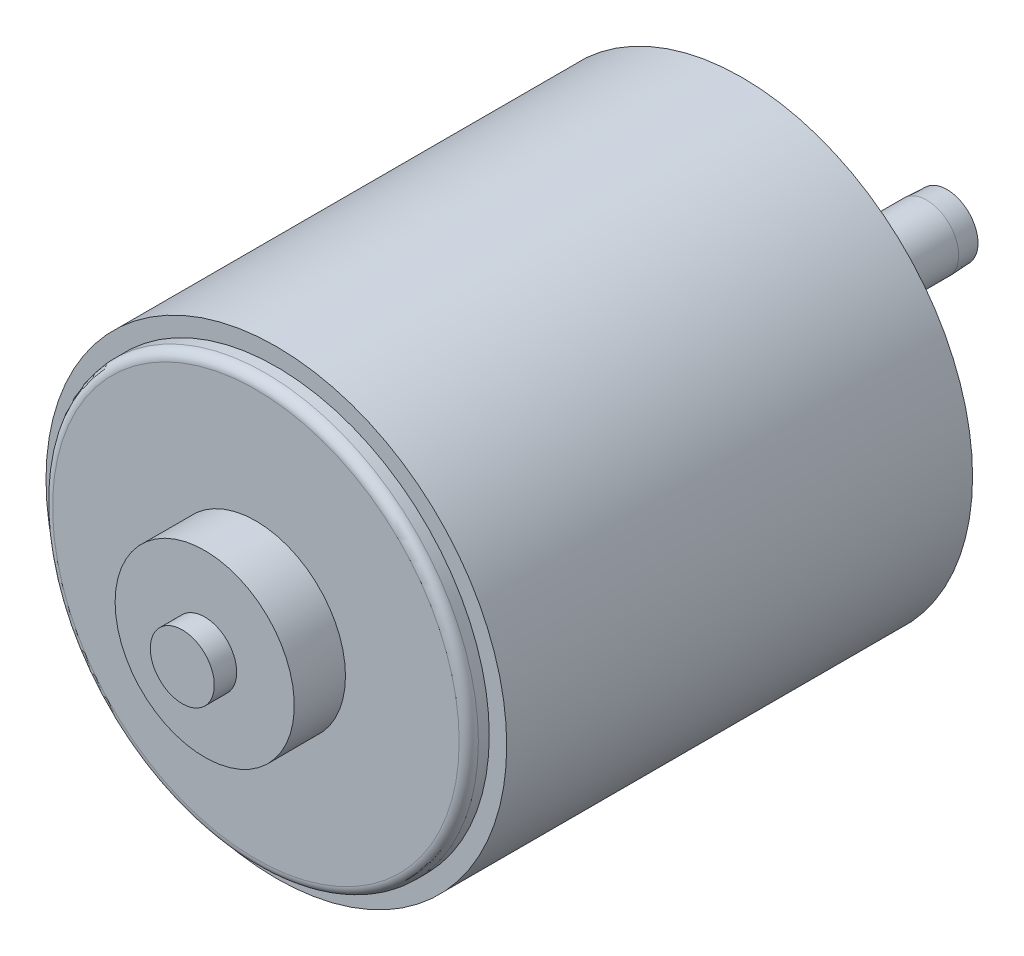
ISO-10303-21;
HEADER;
FILE_DESCRIPTION(('STEP AP214'),'2;1');
FILE_NAME('part.step','',(''),(''),'','','');
FILE_SCHEMA(('AUTOMOTIVE_DESIGN { 1 0 10303 214 1 1 1 1 }'));
ENDSEC;
DATA;
#1=APPLICATION_CONTEXT('core data for automotive mechanical design processes');
#2=APPLICATION_PROTOCOL_DEFINITION('international standard','automotive_design',2000,#1);
#3=PRODUCT_CONTEXT('',#1,'mechanical');
#4=PRODUCT('Part','Part','',(#3));
#5=PRODUCT_RELATED_PRODUCT_CATEGORY('part','',(#4));
#6=PRODUCT_DEFINITION_FORMATION('','',#4);
#7=PRODUCT_DEFINITION_CONTEXT('part definition',#1,'design');
#8=PRODUCT_DEFINITION('design','',#6,#7);
#9=PRODUCT_DEFINITION_SHAPE('','',#8);
#10=(LENGTH_UNIT() NAMED_UNIT(*) SI_UNIT(.MILLI.,.METRE.));
#11=(NAMED_UNIT(*) PLANE_ANGLE_UNIT() SI_UNIT($,.RADIAN.));
#12=(NAMED_UNIT(*) SI_UNIT($,.STERADIAN.) SOLID_ANGLE_UNIT());
#13=UNCERTAINTY_MEASURE_WITH_UNIT(LENGTH_MEASURE(1.E-05),#10,'distance_accuracy_value','');
#14=(GEOMETRIC_REPRESENTATION_CONTEXT(3) GLOBAL_UNCERTAINTY_ASSIGNED_CONTEXT((#13)) GLOBAL_UNIT_ASSIGNED_CONTEXT((#10,
#11,#12)) REPRESENTATION_CONTEXT('',''));
#15=CARTESIAN_POINT('',(0.,0.,0.));
#16=DIRECTION('',(0.,0.,1.));
#17=DIRECTION('',(1.,0.,0.));
#18=AXIS2_PLACEMENT_3D('',#15,#16,#17);
#19=CARTESIAN_POINT('',(0.,0.,38.));
#20=DIRECTION('',(0.,0.,-1.));
#21=DIRECTION('',(-1.,0.,0.));
#22=AXIS2_PLACEMENT_3D('',#19,#20,#21);
#23=CYLINDRICAL_SURFACE('',#22,18.);
#24=CARTESIAN_POINT('',(0.,0.,0.));
#25=DIRECTION('',(0.,0.,1.));
#26=DIRECTION('',(1.,0.,0.));
#27=AXIS2_PLACEMENT_3D('',#24,#25,#26);
#28=CIRCLE('',#27,18.);
#29=CARTESIAN_POINT('',(18.,0.,0.));
#30=VERTEX_POINT('',#29);
#31=EDGE_CURVE('E141',#30,#30,#28,.T.);
#32=ORIENTED_EDGE('',*,*,#31,.T.);
#33=EDGE_LOOP('',(#32));
#34=FACE_BOUND('',#33,.T.);
#35=CARTESIAN_POINT('',(0.,0.,36.4));
#36=DIRECTION('',(0.,0.,1.));
#37=DIRECTION('',(1.,0.,0.));
#38=AXIS2_PLACEMENT_3D('',#35,#36,#37);
#39=CIRCLE('',#38,18.);
#40=CARTESIAN_POINT('',(18.,0.,36.4));
#41=VERTEX_POINT('',#40);
#42=EDGE_CURVE('E252',#41,#41,#39,.T.);
#43=ORIENTED_EDGE('',*,*,#42,.F.);
#44=EDGE_LOOP('',(#43));
#45=FACE_BOUND('',#44,.T.);
#46=ADVANCED_FACE('F71',(#34,#45),#23,.T.);
#47=CARTESIAN_POINT('',(0.,0.,0.));
#48=DIRECTION('',(0.,0.,1.));
#49=DIRECTION('',(1.,0.,0.));
#50=AXIS2_PLACEMENT_3D('',#47,#48,#49);
#51=PLANE('',#50);
#52=CARTESIAN_POINT('',(0.,12.5,0.));
#53=DIRECTION('',(0.,0.,-1.));
#54=DIRECTION('',(-1.,0.,0.));
#55=AXIS2_PLACEMENT_3D('',#52,#53,#54);
#56=CIRCLE('',#55,1.25);
#57=CARTESIAN_POINT('',(-1.25,12.5,0.));
#58=VERTEX_POINT('',#57);
#59=EDGE_CURVE('E105',#58,#58,#56,.T.);
#60=ORIENTED_EDGE('',*,*,#59,.F.);
#61=EDGE_LOOP('',(#60));
#62=FACE_BOUND('',#61,.T.);
#63=CARTESIAN_POINT('',(10.8253175473055,6.24999999999997,0.));
#64=DIRECTION('',(0.,0.,-1.));
#65=DIRECTION('',(-1.,0.,0.));
#66=AXIS2_PLACEMENT_3D('',#63,#64,#65);
#67=CIRCLE('',#66,1.25);
#68=CARTESIAN_POINT('',(9.5753175473055,6.24999999999997,0.));
#69=VERTEX_POINT('',#68);
#70=EDGE_CURVE('E104',#69,#69,#67,.T.);
#71=ORIENTED_EDGE('',*,*,#70,.F.);
#72=EDGE_LOOP('',(#71));
#73=FACE_BOUND('',#72,.T.);
#74=CARTESIAN_POINT('',(0.,-12.5,0.));
#75=DIRECTION('',(0.,0.,-1.));
#76=DIRECTION('',(-1.,0.,0.));
#77=AXIS2_PLACEMENT_3D('',#74,#75,#76);
#78=CIRCLE('',#77,1.25);
#79=CARTESIAN_POINT('',(-1.25,-12.5,0.));
#80=VERTEX_POINT('',#79);
#81=EDGE_CURVE('E123',#80,#80,#78,.T.);
#82=ORIENTED_EDGE('',*,*,#81,.F.);
#83=EDGE_LOOP('',(#82));
#84=FACE_BOUND('',#83,.T.);
#85=CARTESIAN_POINT('',(-10.8253175473055,6.24999999999998,0.));
#86=DIRECTION('',(0.,0.,-1.));
#87=DIRECTION('',(-1.,0.,0.));
#88=AXIS2_PLACEMENT_3D('',#85,#86,#87);
#89=CIRCLE('',#88,1.25);
#90=CARTESIAN_POINT('',(-12.0753175473055,6.24999999999998,0.));
#91=VERTEX_POINT('',#90);
#92=EDGE_CURVE('E129',#91,#91,#89,.T.);
#93=ORIENTED_EDGE('',*,*,#92,.F.);
#94=EDGE_LOOP('',(#93));
#95=FACE_BOUND('',#94,.T.);
#96=CARTESIAN_POINT('',(0.,0.,0.));
#97=DIRECTION('',(0.,0.,1.));
#98=DIRECTION('',(1.,0.,0.));
#99=AXIS2_PLACEMENT_3D('',#96,#97,#98);
#100=CIRCLE('',#99,7.);
#101=CARTESIAN_POINT('',(7.,0.,0.));
#102=VERTEX_POINT('',#101);
#103=EDGE_CURVE('E149',#102,#102,#100,.F.);
#104=ORIENTED_EDGE('',*,*,#103,.F.);
#105=EDGE_LOOP('',(#104));
#106=FACE_BOUND('',#105,.T.);
#107=ORIENTED_EDGE('',*,*,#31,.F.);
#108=EDGE_LOOP('',(#107));
#109=FACE_BOUND('',#108,.T.);
#110=ADVANCED_FACE('F182',(#62,#73,#84,#95,#106,#109),#51,.F.);
#111=CARTESIAN_POINT('',(0.,0.,-4.));
#112=DIRECTION('',(0.,0.,1.));
#113=DIRECTION('',(1.,0.,0.));
#114=AXIS2_PLACEMENT_3D('',#111,#112,#113);
#115=CYLINDRICAL_SURFACE('',#114,7.);
#116=CARTESIAN_POINT('',(0.,0.,-4.));
#117=DIRECTION('',(0.,0.,-1.));
#118=DIRECTION('',(-1.,0.,0.));
#119=AXIS2_PLACEMENT_3D('',#116,#117,#118);
#120=CIRCLE('',#119,7.);
#121=CARTESIAN_POINT('',(-7.,0.,-4.));
#122=VERTEX_POINT('',#121);
#123=EDGE_CURVE('E137',#122,#122,#120,.T.);
#124=ORIENTED_EDGE('',*,*,#123,.F.);
#125=EDGE_LOOP('',(#124));
#126=FACE_BOUND('',#125,.T.);
#127=ORIENTED_EDGE('',*,*,#103,.T.);
#128=EDGE_LOOP('',(#127));
#129=FACE_BOUND('',#128,.T.);
#130=ADVANCED_FACE('F186',(#126,#129),#115,.T.);
#131=CARTESIAN_POINT('',(0.,0.,-4.));
#132=DIRECTION('',(0.,0.,-1.));
#133=DIRECTION('',(-1.,0.,0.));
#134=AXIS2_PLACEMENT_3D('',#131,#132,#133);
#135=PLANE('',#134);
#136=CARTESIAN_POINT('',(0.,0.,-4.));
#137=DIRECTION('',(0.,0.,-1.));
#138=DIRECTION('',(-1.,0.,0.));
#139=AXIS2_PLACEMENT_3D('',#136,#137,#138);
#140=CIRCLE('',#139,2.5);
#141=CARTESIAN_POINT('',(-2.5,0.,-4.));
#142=VERTEX_POINT('',#141);
#143=EDGE_CURVE('E145',#142,#142,#140,.F.);
#144=ORIENTED_EDGE('',*,*,#143,.T.);
#145=EDGE_LOOP('',(#144));
#146=FACE_BOUND('',#145,.T.);
#147=ORIENTED_EDGE('',*,*,#123,.T.);
#148=EDGE_LOOP('',(#147));
#149=FACE_BOUND('',#148,.T.);
#150=ADVANCED_FACE('F203',(#146,#149),#135,.T.);
#151=CARTESIAN_POINT('',(0.,0.,45.));
#152=DIRECTION('',(0.,0.,-1.));
#153=DIRECTION('',(-1.,0.,0.));
#154=AXIS2_PLACEMENT_3D('',#151,#152,#153);
#155=CYLINDRICAL_SURFACE('',#154,2.5);
#156=CARTESIAN_POINT('',(0.,0.,-14.4125));
#157=DIRECTION('',(0.,0.,1.));
#158=DIRECTION('',(1.,0.,0.));
#159=AXIS2_PLACEMENT_3D('',#156,#157,#158);
#160=CIRCLE('',#159,2.5);
#161=CARTESIAN_POINT('',(-2.5,0.,-14.4125));
#162=VERTEX_POINT('',#161);
#163=EDGE_CURVE('E253',#162,#162,#160,.T.);
#164=CARTESIAN_POINT('',(-2.5,0.,-14.4125));
#165=CARTESIAN_POINT('',(-2.5,0.,-14.3040364583333));
#166=CARTESIAN_POINT('',(-2.5,0.,-14.1955729166666));
#167=CARTESIAN_POINT('',(-2.5,0.,-13.9786458333333));
#168=CARTESIAN_POINT('',(-2.5,0.,-13.8701822916666));
#169=CARTESIAN_POINT('',(-2.5,0.,-13.6532552083333));
#170=CARTESIAN_POINT('',(-2.5,0.,-13.5447916666666));
#171=CARTESIAN_POINT('',(-2.5,0.,-13.3278645833333));
#172=CARTESIAN_POINT('',(-2.5,0.,-13.2194010416666));
#173=CARTESIAN_POINT('',(-2.5,0.,-13.0024739583333));
#174=CARTESIAN_POINT('',(-2.5,0.,-12.8940104166666));
#175=CARTESIAN_POINT('',(-2.5,0.,-12.6770833333333));
#176=CARTESIAN_POINT('',(-2.5,0.,-12.5686197916666));
#177=CARTESIAN_POINT('',(-2.5,0.,-12.3516927083333));
#178=CARTESIAN_POINT('',(-2.5,0.,-12.2432291666666));
#179=CARTESIAN_POINT('',(-2.5,0.,-12.0263020833333));
#180=CARTESIAN_POINT('',(-2.5,0.,-11.9178385416666));
#181=CARTESIAN_POINT('',(-2.5,0.,-11.7009114583333));
#182=CARTESIAN_POINT('',(-2.5,0.,-11.5924479166666));
#183=CARTESIAN_POINT('',(-2.5,0.,-11.3755208333333));
#184=CARTESIAN_POINT('',(-2.5,0.,-11.2670572916666));
#185=CARTESIAN_POINT('',(-2.5,0.,-11.0501302083333));
#186=CARTESIAN_POINT('',(-2.5,0.,-10.9416666666666));
#187=CARTESIAN_POINT('',(-2.5,0.,-10.7247395833333));
#188=CARTESIAN_POINT('',(-2.5,0.,-10.6162760416666));
#189=CARTESIAN_POINT('',(-2.5,0.,-10.3993489583333));
#190=CARTESIAN_POINT('',(-2.5,0.,-10.2908854166666));
#191=CARTESIAN_POINT('',(-2.5,0.,-10.0739583333333));
#192=CARTESIAN_POINT('',(-2.5,0.,-9.96549479166665));
#193=CARTESIAN_POINT('',(-2.5,0.,-9.74856770833332));
#194=CARTESIAN_POINT('',(-2.5,0.,-9.64010416666665));
#195=CARTESIAN_POINT('',(-2.5,0.,-9.42317708333332));
#196=CARTESIAN_POINT('',(-2.5,0.,-9.31471354166665));
#197=CARTESIAN_POINT('',(-2.5,0.,-9.09778645833332));
#198=CARTESIAN_POINT('',(-2.5,0.,-8.98932291666665));
#199=CARTESIAN_POINT('',(-2.5,0.,-8.77239583333332));
#200=CARTESIAN_POINT('',(-2.5,0.,-8.66393229166666));
#201=CARTESIAN_POINT('',(-2.5,0.,-8.44700520833332));
#202=CARTESIAN_POINT('',(-2.5,0.,-8.33854166666666));
#203=CARTESIAN_POINT('',(-2.5,0.,-8.12161458333332));
#204=CARTESIAN_POINT('',(-2.5,0.,-8.01315104166665));
#205=CARTESIAN_POINT('',(-2.5,0.,-7.79622395833332));
#206=CARTESIAN_POINT('',(-2.5,0.,-7.68776041666665));
#207=CARTESIAN_POINT('',(-2.5,0.,-7.47083333333332));
#208=CARTESIAN_POINT('',(-2.5,0.,-7.36236979166666));
#209=CARTESIAN_POINT('',(-2.5,0.,-7.14544270833332));
#210=CARTESIAN_POINT('',(-2.5,0.,-7.03697916666666));
#211=CARTESIAN_POINT('',(-2.5,0.,-6.82005208333333));
#212=CARTESIAN_POINT('',(-2.5,0.,-6.71158854166666));
#213=CARTESIAN_POINT('',(-2.5,0.,-6.49466145833333));
#214=CARTESIAN_POINT('',(-2.5,0.,-6.38619791666666));
#215=CARTESIAN_POINT('',(-2.5,0.,-6.16927083333332));
#216=CARTESIAN_POINT('',(-2.5,0.,-6.06080729166666));
#217=CARTESIAN_POINT('',(-2.5,0.,-5.84388020833333));
#218=CARTESIAN_POINT('',(-2.5,0.,-5.73541666666666));
#219=CARTESIAN_POINT('',(-2.5,0.,-5.51848958333333));
#220=CARTESIAN_POINT('',(-2.5,0.,-5.41002604166666));
#221=CARTESIAN_POINT('',(-2.5,0.,-5.19309895833333));
#222=CARTESIAN_POINT('',(-2.5,0.,-5.08463541666666));
#223=CARTESIAN_POINT('',(-2.5,0.,-4.86770833333333));
#224=CARTESIAN_POINT('',(-2.5,0.,-4.75924479166666));
#225=CARTESIAN_POINT('',(-2.5,0.,-4.54231770833333));
#226=CARTESIAN_POINT('',(-2.5,0.,-4.43385416666666));
#227=CARTESIAN_POINT('',(-2.5,0.,-4.21692708333333));
#228=CARTESIAN_POINT('',(-2.5,0.,-4.10846354166666));
#229=CARTESIAN_POINT('',(-2.5,0.,-4.));
#230=B_SPLINE_CURVE_WITH_KNOTS('',3,(#164,#165,#166,#167,#168,#169,#170,#171,#172,#173,#174,
#175,#176,#177,#178,#179,#180,#181,#182,#183,#184,#185,#186,#187,#188,#189,#190,#191,#192,#193,
#194,#195,#196,#197,#198,#199,#200,#201,#202,#203,#204,#205,#206,#207,#208,#209,#210,#211,#212,
#213,#214,#215,#216,#217,#218,#219,#220,#221,#222,#223,#224,#225,#226,#227,#228,#229),
.UNSPECIFIED.,.F.,.F.,(4,2,2,2,2,2,2,2,2,2,2,2,2,2,2,2,2,2,2,2,2,2,2,2,2,2,2,2,2,2,2,2,4),(0.,
0.325390624999998,0.650781249999996,0.976171875000001,1.3015625,1.626953125,1.95234374999999,
2.27773437499999,2.603125,2.928515625,3.25390624999999,3.57929687499999,3.90468749999999,
4.230078125,4.55546874999999,4.88085937499999,5.20624999999999,5.53164062499999,
5.85703124999998,6.18242187499998,6.50781249999999,6.83320312499999,7.15859374999998,
7.48398437499998,7.80937499999998,8.13476562499998,8.46015624999998,8.78554687499998,
9.11093749999998,9.43632812499998,9.76171874999998,10.087109375,10.4125),.UNSPECIFIED.);
#231=EDGE_CURVE('BSEAM197',#162,#142,#230,.T.);
#232=ORIENTED_EDGE('',*,*,#163,.T.);
#233=ORIENTED_EDGE('',*,*,#143,.F.);
#234=ORIENTED_EDGE('',*,*,#231,.T.);
#235=ORIENTED_EDGE('',*,*,#231,.F.);
#236=EDGE_LOOP('',(#232,#234,#233,#235));
#237=FACE_BOUND('',#236,.T.);
#238=ADVANCED_FACE('F197',(#237),#155,.T.);
#239=CARTESIAN_POINT('',(-10.8253175473055,6.24999999999998,3.));
#240=DIRECTION('',(0.,0.,-1.));
#241=DIRECTION('',(-1.,0.,0.));
#242=AXIS2_PLACEMENT_3D('',#239,#240,#241);
#243=CONICAL_SURFACE('',#242,1.25,1.02974425867665);
#244=CARTESIAN_POINT('',(-10.8253175473055,6.24999999999998,3.75107577378445));
#245=VERTEX_POINT('',#244);
#246=VERTEX_LOOP('',#245);
#247=FACE_BOUND('',#246,.T.);
#248=CARTESIAN_POINT('',(-10.8253175473055,6.24999999999998,3.));
#249=DIRECTION('',(0.,0.,-1.));
#250=DIRECTION('',(-1.,0.,0.));
#251=AXIS2_PLACEMENT_3D('',#248,#249,#250);
#252=CIRCLE('',#251,1.25);
#253=CARTESIAN_POINT('',(-12.0753175473055,6.24999999999998,3.));
#254=VERTEX_POINT('',#253);
#255=EDGE_CURVE('E133',#254,#254,#252,.T.);
#256=ORIENTED_EDGE('',*,*,#255,.T.);
#257=EDGE_LOOP('',(#256));
#258=FACE_BOUND('',#257,.T.);
#259=ADVANCED_FACE('F208',(#247,#258),#243,.F.);
#260=CARTESIAN_POINT('',(-10.8253175473055,6.24999999999998,0.));
#261=DIRECTION('',(0.,0.,-1.));
#262=DIRECTION('',(-1.,0.,0.));
#263=AXIS2_PLACEMENT_3D('',#260,#261,#262);
#264=CYLINDRICAL_SURFACE('',#263,1.25);
#265=ORIENTED_EDGE('',*,*,#255,.F.);
#266=EDGE_LOOP('',(#265));
#267=FACE_BOUND('',#266,.T.);
#268=ORIENTED_EDGE('',*,*,#92,.T.);
#269=EDGE_LOOP('',(#268));
#270=FACE_BOUND('',#269,.T.);
#271=ADVANCED_FACE('F211',(#267,#270),#264,.F.);
#272=CARTESIAN_POINT('',(0.,-12.5,3.));
#273=DIRECTION('',(0.,0.,-1.));
#274=DIRECTION('',(-1.,0.,0.));
#275=AXIS2_PLACEMENT_3D('',#272,#273,#274);
#276=CONICAL_SURFACE('',#275,1.25,1.02974425867665);
#277=CARTESIAN_POINT('',(0.,-12.5,3.75107577378445));
#278=VERTEX_POINT('',#277);
#279=VERTEX_LOOP('',#278);
#280=FACE_BOUND('',#279,.T.);
#281=CARTESIAN_POINT('',(0.,-12.5,3.));
#282=DIRECTION('',(0.,0.,-1.));
#283=DIRECTION('',(-1.,0.,0.));
#284=AXIS2_PLACEMENT_3D('',#281,#282,#283);
#285=CIRCLE('',#284,1.25);
#286=CARTESIAN_POINT('',(-1.25,-12.5,3.));
#287=VERTEX_POINT('',#286);
#288=EDGE_CURVE('E126',#287,#287,#285,.T.);
#289=ORIENTED_EDGE('',*,*,#288,.T.);
#290=EDGE_LOOP('',(#289));
#291=FACE_BOUND('',#290,.T.);
#292=ADVANCED_FACE('F214',(#280,#291),#276,.F.);
#293=CARTESIAN_POINT('',(0.,-12.5,0.));
#294=DIRECTION('',(0.,0.,-1.));
#295=DIRECTION('',(-1.,0.,0.));
#296=AXIS2_PLACEMENT_3D('',#293,#294,#295);
#297=CYLINDRICAL_SURFACE('',#296,1.25);
#298=ORIENTED_EDGE('',*,*,#288,.F.);
#299=EDGE_LOOP('',(#298));
#300=FACE_BOUND('',#299,.T.);
#301=ORIENTED_EDGE('',*,*,#81,.T.);
#302=EDGE_LOOP('',(#301));
#303=FACE_BOUND('',#302,.T.);
#304=ADVANCED_FACE('F218',(#300,#303),#297,.F.);
#305=CARTESIAN_POINT('',(10.8253175473055,6.24999999999997,3.));
#306=DIRECTION('',(0.,0.,-1.));
#307=DIRECTION('',(-1.,0.,0.));
#308=AXIS2_PLACEMENT_3D('',#305,#306,#307);
#309=CONICAL_SURFACE('',#308,1.25,1.02974425867665);
#310=CARTESIAN_POINT('',(10.8253175473055,6.24999999999997,3.75107577378445));
#311=VERTEX_POINT('',#310);
#312=VERTEX_LOOP('',#311);
#313=FACE_BOUND('',#312,.T.);
#314=CARTESIAN_POINT('',(10.8253175473055,6.24999999999997,3.));
#315=DIRECTION('',(0.,0.,-1.));
#316=DIRECTION('',(-1.,0.,0.));
#317=AXIS2_PLACEMENT_3D('',#314,#315,#316);
#318=CIRCLE('',#317,1.25);
#319=CARTESIAN_POINT('',(9.5753175473055,6.24999999999997,3.));
#320=VERTEX_POINT('',#319);
#321=EDGE_CURVE('E112',#320,#320,#318,.T.);
#322=ORIENTED_EDGE('',*,*,#321,.T.);
#323=EDGE_LOOP('',(#322));
#324=FACE_BOUND('',#323,.T.);
#325=ADVANCED_FACE('F221',(#313,#324),#309,.F.);
#326=CARTESIAN_POINT('',(10.8253175473055,6.24999999999997,0.));
#327=DIRECTION('',(0.,0.,-1.));
#328=DIRECTION('',(-1.,0.,0.));
#329=AXIS2_PLACEMENT_3D('',#326,#327,#328);
#330=CYLINDRICAL_SURFACE('',#329,1.25);
#331=ORIENTED_EDGE('',*,*,#321,.F.);
#332=EDGE_LOOP('',(#331));
#333=FACE_BOUND('',#332,.T.);
#334=ORIENTED_EDGE('',*,*,#70,.T.);
#335=EDGE_LOOP('',(#334));
#336=FACE_BOUND('',#335,.T.);
#337=ADVANCED_FACE('F97',(#333,#336),#330,.F.);
#338=CARTESIAN_POINT('',(0.,12.5,3.));
#339=DIRECTION('',(0.,0.,-1.));
#340=DIRECTION('',(-1.,0.,0.));
#341=AXIS2_PLACEMENT_3D('',#338,#339,#340);
#342=CONICAL_SURFACE('',#341,1.25,1.02974425867665);
#343=CARTESIAN_POINT('',(0.,12.5,3.75107577378445));
#344=VERTEX_POINT('',#343);
#345=VERTEX_LOOP('',#344);
#346=FACE_BOUND('',#345,.T.);
#347=CARTESIAN_POINT('',(0.,12.5,3.));
#348=DIRECTION('',(0.,0.,-1.));
#349=DIRECTION('',(-1.,0.,0.));
#350=AXIS2_PLACEMENT_3D('',#347,#348,#349);
#351=CIRCLE('',#350,1.25);
#352=CARTESIAN_POINT('',(-1.25,12.5,3.));
#353=VERTEX_POINT('',#352);
#354=EDGE_CURVE('E101',#353,#353,#351,.T.);
#355=ORIENTED_EDGE('',*,*,#354,.T.);
#356=EDGE_LOOP('',(#355));
#357=FACE_BOUND('',#356,.T.);
#358=ADVANCED_FACE('F93',(#346,#357),#342,.F.);
#359=CARTESIAN_POINT('',(0.,12.5,0.));
#360=DIRECTION('',(0.,0.,-1.));
#361=DIRECTION('',(-1.,0.,0.));
#362=AXIS2_PLACEMENT_3D('',#359,#360,#361);
#363=CYLINDRICAL_SURFACE('',#362,1.25);
#364=ORIENTED_EDGE('',*,*,#354,.F.);
#365=EDGE_LOOP('',(#364));
#366=FACE_BOUND('',#365,.T.);
#367=ORIENTED_EDGE('',*,*,#59,.T.);
#368=EDGE_LOOP('',(#367));
#369=FACE_BOUND('',#368,.T.);
#370=ADVANCED_FACE('F96',(#366,#369),#363,.F.);
#371=CARTESIAN_POINT('',(0.,0.,36.4));
#372=DIRECTION('',(0.,0.,1.));
#373=DIRECTION('',(1.,0.,0.));
#374=AXIS2_PLACEMENT_3D('',#371,#372,#373);
#375=PLANE('',#374);
#376=CARTESIAN_POINT('',(0.,0.,36.4));
#377=DIRECTION('',(0.,0.,1.));
#378=DIRECTION('',(1.,0.,0.));
#379=AXIS2_PLACEMENT_3D('',#376,#377,#378);
#380=CIRCLE('',#379,16.635);
#381=CARTESIAN_POINT('',(16.635,0.,36.4));
#382=VERTEX_POINT('',#381);
#383=EDGE_CURVE('E251',#382,#382,#380,.T.);
#384=ORIENTED_EDGE('',*,*,#383,.F.);
#385=EDGE_LOOP('',(#384));
#386=FACE_BOUND('',#385,.T.);
#387=ORIENTED_EDGE('',*,*,#42,.T.);
#388=EDGE_LOOP('',(#387));
#389=FACE_BOUND('',#388,.T.);
#390=ADVANCED_FACE('F231',(#386,#389),#375,.T.);
#391=CARTESIAN_POINT('',(0.,0.,36.4));
#392=DIRECTION('',(0.,0.,1.));
#393=DIRECTION('',(1.,0.,0.));
#394=AXIS2_PLACEMENT_3D('',#391,#392,#393);
#395=CYLINDRICAL_SURFACE('',#394,16.635);
#396=CARTESIAN_POINT('',(0.,0.,37.25));
#397=DIRECTION('',(0.,0.,1.));
#398=DIRECTION('',(1.,0.,0.));
#399=AXIS2_PLACEMENT_3D('',#396,#397,#398);
#400=CIRCLE('',#399,16.635);
#401=CARTESIAN_POINT('',(16.635,0.,37.25));
#402=VERTEX_POINT('',#401);
#403=EDGE_CURVE('E15',#402,#402,#400,.F.);
#404=ORIENTED_EDGE('',*,*,#403,.T.);
#405=EDGE_LOOP('',(#404));
#406=FACE_BOUND('',#405,.T.);
#407=ORIENTED_EDGE('',*,*,#383,.T.);
#408=EDGE_LOOP('',(#407));
#409=FACE_BOUND('',#408,.T.);
#410=ADVANCED_FACE('F234',(#406,#409),#395,.T.);
#411=CARTESIAN_POINT('',(0.,0.,43.75));
#412=DIRECTION('',(0.,0.,-1.));
#413=DIRECTION('',(-1.,0.,0.));
#414=AXIS2_PLACEMENT_3D('',#411,#412,#413);
#415=PLANE('',#414);
#416=CARTESIAN_POINT('',(0.,0.,43.75));
#417=DIRECTION('',(0.,0.,-1.));
#418=DIRECTION('',(-1.,0.,0.));
#419=AXIS2_PLACEMENT_3D('',#416,#417,#418);
#420=CIRCLE('',#419,2.5);
#421=CARTESIAN_POINT('',(-2.5,0.,43.75));
#422=VERTEX_POINT('',#421);
#423=EDGE_CURVE('E116',#422,#422,#420,.F.);
#424=ORIENTED_EDGE('',*,*,#423,.T.);
#425=EDGE_LOOP('',(#424));
#426=FACE_BOUND('',#425,.T.);
#427=ADVANCED_FACE('F195',(#426),#415,.F.);
#428=CARTESIAN_POINT('',(0.,0.,42.));
#429=DIRECTION('',(0.,0.,1.));
#430=DIRECTION('',(1.,0.,0.));
#431=AXIS2_PLACEMENT_3D('',#428,#429,#430);
#432=CIRCLE('',#431,2.5);
#433=CARTESIAN_POINT('',(-2.5,0.,42.));
#434=VERTEX_POINT('',#433);
#435=EDGE_CURVE('E153',#434,#434,#432,.F.);
#436=CARTESIAN_POINT('',(-2.5,0.,42.));
#437=CARTESIAN_POINT('',(-2.5,0.,42.0182291666667));
#438=CARTESIAN_POINT('',(-2.5,0.,42.0364583333333));
#439=CARTESIAN_POINT('',(-2.5,0.,42.0729166666667));
#440=CARTESIAN_POINT('',(-2.5,0.,42.0911458333333));
#441=CARTESIAN_POINT('',(-2.5,0.,42.1276041666667));
#442=CARTESIAN_POINT('',(-2.5,0.,42.1458333333333));
#443=CARTESIAN_POINT('',(-2.5,0.,42.1822916666667));
#444=CARTESIAN_POINT('',(-2.5,0.,42.2005208333333));
#445=CARTESIAN_POINT('',(-2.5,0.,42.2369791666667));
#446=CARTESIAN_POINT('',(-2.5,0.,42.2552083333333));
#447=CARTESIAN_POINT('',(-2.5,0.,42.2916666666667));
#448=CARTESIAN_POINT('',(-2.5,0.,42.3098958333333));
#449=CARTESIAN_POINT('',(-2.5,0.,42.3463541666667));
#450=CARTESIAN_POINT('',(-2.5,0.,42.3645833333333));
#451=CARTESIAN_POINT('',(-2.5,0.,42.4010416666667));
#452=CARTESIAN_POINT('',(-2.5,0.,42.4192708333333));
#453=CARTESIAN_POINT('',(-2.5,0.,42.4557291666667));
#454=CARTESIAN_POINT('',(-2.5,0.,42.4739583333333));
#455=CARTESIAN_POINT('',(-2.5,0.,42.5104166666667));
#456=CARTESIAN_POINT('',(-2.5,0.,42.5286458333333));
#457=CARTESIAN_POINT('',(-2.5,0.,42.5651041666667));
#458=CARTESIAN_POINT('',(-2.5,0.,42.5833333333333));
#459=CARTESIAN_POINT('',(-2.5,0.,42.6197916666667));
#460=CARTESIAN_POINT('',(-2.5,0.,42.6380208333333));
#461=CARTESIAN_POINT('',(-2.5,0.,42.6744791666667));
#462=CARTESIAN_POINT('',(-2.5,0.,42.6927083333333));
#463=CARTESIAN_POINT('',(-2.5,0.,42.7291666666667));
#464=CARTESIAN_POINT('',(-2.5,0.,42.7473958333333));
#465=CARTESIAN_POINT('',(-2.5,0.,42.7838541666667));
#466=CARTESIAN_POINT('',(-2.5,0.,42.8020833333333));
#467=CARTESIAN_POINT('',(-2.5,0.,42.8385416666667));
#468=CARTESIAN_POINT('',(-2.5,0.,42.8567708333333));
#469=CARTESIAN_POINT('',(-2.5,0.,42.8932291666667));
#470=CARTESIAN_POINT('',(-2.5,0.,42.9114583333333));
#471=CARTESIAN_POINT('',(-2.5,0.,42.9479166666667));
#472=CARTESIAN_POINT('',(-2.5,0.,42.9661458333333));
#473=CARTESIAN_POINT('',(-2.5,0.,43.0026041666667));
#474=CARTESIAN_POINT('',(-2.5,0.,43.0208333333333));
#475=CARTESIAN_POINT('',(-2.5,0.,43.0572916666667));
#476=CARTESIAN_POINT('',(-2.5,0.,43.0755208333333));
#477=CARTESIAN_POINT('',(-2.5,0.,43.1119791666667));
#478=CARTESIAN_POINT('',(-2.5,0.,43.1302083333333));
#479=CARTESIAN_POINT('',(-2.5,0.,43.1666666666667));
#480=CARTESIAN_POINT('',(-2.5,0.,43.1848958333333));
#481=CARTESIAN_POINT('',(-2.5,0.,43.2213541666667));
#482=CARTESIAN_POINT('',(-2.5,0.,43.2395833333333));
#483=CARTESIAN_POINT('',(-2.5,0.,43.2760416666667));
#484=CARTESIAN_POINT('',(-2.5,0.,43.2942708333333));
#485=CARTESIAN_POINT('',(-2.5,0.,43.3307291666667));
#486=CARTESIAN_POINT('',(-2.5,0.,43.3489583333333));
#487=CARTESIAN_POINT('',(-2.5,0.,43.3854166666667));
#488=CARTESIAN_POINT('',(-2.5,0.,43.4036458333333));
#489=CARTESIAN_POINT('',(-2.5,0.,43.4401041666667));
#490=CARTESIAN_POINT('',(-2.5,0.,43.4583333333333));
#491=CARTESIAN_POINT('',(-2.5,0.,43.4947916666667));
#492=CARTESIAN_POINT('',(-2.5,0.,43.5130208333333));
#493=CARTESIAN_POINT('',(-2.5,0.,43.5494791666667));
#494=CARTESIAN_POINT('',(-2.5,0.,43.5677083333333));
#495=CARTESIAN_POINT('',(-2.5,0.,43.6041666666667));
#496=CARTESIAN_POINT('',(-2.5,0.,43.6223958333333));
#497=CARTESIAN_POINT('',(-2.5,0.,43.6588541666667));
#498=CARTESIAN_POINT('',(-2.5,0.,43.6770833333333));
#499=CARTESIAN_POINT('',(-2.5,0.,43.7135416666667));
#500=CARTESIAN_POINT('',(-2.5,0.,43.7317708333333));
#501=CARTESIAN_POINT('',(-2.5,0.,43.75));
#502=B_SPLINE_CURVE_WITH_KNOTS('',3,(#436,#437,#438,#439,#440,#441,#442,#443,#444,#445,#446,
#447,#448,#449,#450,#451,#452,#453,#454,#455,#456,#457,#458,#459,#460,#461,#462,#463,#464,#465,
#466,#467,#468,#469,#470,#471,#472,#473,#474,#475,#476,#477,#478,#479,#480,#481,#482,#483,#484,
#485,#486,#487,#488,#489,#490,#491,#492,#493,#494,#495,#496,#497,#498,#499,#500,#501),
.UNSPECIFIED.,.F.,.F.,(4,2,2,2,2,2,2,2,2,2,2,2,2,2,2,2,2,2,2,2,2,2,2,2,2,2,2,2,2,2,2,2,4),(0.,
0.0546875000000044,0.109375000000002,0.164062500000006,0.218750000000004,0.273437500000008,
0.328125000000005,0.382812500000003,0.437500000000007,0.492187500000005,0.546875000000009,
0.601562500000007,0.656250000000004,0.710937500000008,0.765625000000006,0.82031250000001,
0.875000000000008,0.929687500000005,0.98437500000001,1.03906250000001,1.09375000000001,
1.14843750000001,1.20312500000001,1.25781250000001,1.31250000000001,1.36718750000001,
1.42187500000001,1.47656250000001,1.53125000000001,1.58593750000001,1.64062500000001,
1.69531250000001,1.75000000000002),.UNSPECIFIED.);
#503=EDGE_CURVE('BSEAM191',#434,#422,#502,.T.);
#504=ORIENTED_EDGE('',*,*,#435,.F.);
#505=ORIENTED_EDGE('',*,*,#423,.F.);
#506=ORIENTED_EDGE('',*,*,#503,.T.);
#507=ORIENTED_EDGE('',*,*,#503,.F.);
#508=EDGE_LOOP('',(#504,#506,#505,#507));
#509=FACE_BOUND('',#508,.T.);
#510=ADVANCED_FACE('F191',(#509),#155,.T.);
#511=CARTESIAN_POINT('',(0.,0.,42.));
#512=DIRECTION('',(0.,0.,1.));
#513=DIRECTION('',(-1.,0.,0.));
#514=AXIS2_PLACEMENT_3D('',#511,#512,#513);
#515=PLANE('',#514);
#516=ORIENTED_EDGE('',*,*,#435,.T.);
#517=EDGE_LOOP('',(#516));
#518=FACE_BOUND('',#517,.T.);
#519=CARTESIAN_POINT('',(0.,0.,42.));
#520=DIRECTION('',(0.,0.,-1.));
#521=DIRECTION('',(-1.,0.,0.));
#522=AXIS2_PLACEMENT_3D('',#519,#520,#521);
#523=CIRCLE('',#522,7.);
#524=CARTESIAN_POINT('',(-7.,0.,42.));
#525=VERTEX_POINT('',#524);
#526=EDGE_CURVE('E258',#525,#525,#523,.T.);
#527=ORIENTED_EDGE('',*,*,#526,.F.);
#528=EDGE_LOOP('',(#527));
#529=FACE_BOUND('',#528,.T.);
#530=ADVANCED_FACE('F194',(#518,#529),#515,.T.);
#531=CARTESIAN_POINT('',(0.,0.,42.));
#532=DIRECTION('',(0.,0.,-1.));
#533=DIRECTION('',(-1.,0.,0.));
#534=AXIS2_PLACEMENT_3D('',#531,#532,#533);
#535=CYLINDRICAL_SURFACE('',#534,7.);
#536=ORIENTED_EDGE('',*,*,#526,.T.);
#537=EDGE_LOOP('',(#536));
#538=FACE_BOUND('',#537,.T.);
#539=CARTESIAN_POINT('',(0.,0.,38.));
#540=DIRECTION('',(0.,0.,1.));
#541=DIRECTION('',(1.,0.,0.));
#542=AXIS2_PLACEMENT_3D('',#539,#540,#541);
#543=CIRCLE('',#542,7.);
#544=CARTESIAN_POINT('',(7.,0.,38.));
#545=VERTEX_POINT('',#544);
#546=EDGE_CURVE('E157',#545,#545,#543,.T.);
#547=ORIENTED_EDGE('',*,*,#546,.T.);
#548=EDGE_LOOP('',(#547));
#549=FACE_BOUND('',#548,.T.);
#550=ADVANCED_FACE('F178',(#538,#549),#535,.T.);
#551=CARTESIAN_POINT('',(0.,0.,38.));
#552=DIRECTION('',(0.,0.,1.));
#553=DIRECTION('',(1.,0.,0.));
#554=AXIS2_PLACEMENT_3D('',#551,#552,#553);
#555=PLANE('',#554);
#556=CARTESIAN_POINT('',(0.,0.,38.));
#557=DIRECTION('',(0.,0.,1.));
#558=DIRECTION('',(1.,0.,0.));
#559=AXIS2_PLACEMENT_3D('',#556,#557,#558);
#560=CIRCLE('',#559,15.885);
#561=CARTESIAN_POINT('',(15.885,0.,38.));
#562=VERTEX_POINT('',#561);
#563=EDGE_CURVE('E80',#562,#562,#560,.T.);
#564=ORIENTED_EDGE('',*,*,#563,.T.);
#565=EDGE_LOOP('',(#564));
#566=FACE_BOUND('',#565,.T.);
#567=ORIENTED_EDGE('',*,*,#546,.F.);
#568=EDGE_LOOP('',(#567));
#569=FACE_BOUND('',#568,.T.);
#570=ADVANCED_FACE('F166',(#566,#569),#555,.T.);
#571=CARTESIAN_POINT('',(0.,0.,37.25));
#572=DIRECTION('',(0.,0.,1.));
#573=DIRECTION('',(1.,0.,0.));
#574=AXIS2_PLACEMENT_3D('',#571,#572,#573);
#575=TOROIDAL_SURFACE('',#574,15.885,0.75);
#576=ORIENTED_EDGE('',*,*,#403,.F.);
#577=EDGE_LOOP('',(#576));
#578=FACE_BOUND('',#577,.T.);
#579=ORIENTED_EDGE('',*,*,#563,.F.);
#580=EDGE_LOOP('',(#579));
#581=FACE_BOUND('',#580,.T.);
#582=ADVANCED_FACE('F73',(#578,#581),#575,.T.);
#583=CARTESIAN_POINT('',(0.,0.,-16.));
#584=DIRECTION('',(0.,0.,1.));
#585=DIRECTION('',(1.,0.,0.));
#586=AXIS2_PLACEMENT_3D('',#583,#584,#585);
#587=CONICAL_SURFACE('',#586,2.4238,0.0479631868770757);
#588=ORIENTED_EDGE('',*,*,#163,.F.);
#589=EDGE_LOOP('',(#588));
#590=FACE_BOUND('',#589,.T.);
#591=CARTESIAN_POINT('',(0.,0.,-16.));
#592=DIRECTION('',(0.,0.,1.));
#593=DIRECTION('',(1.,0.,0.));
#594=AXIS2_PLACEMENT_3D('',#591,#592,#593);
#595=CIRCLE('',#594,2.4238);
#596=CARTESIAN_POINT('',(2.4238,0.,-16.));
#597=VERTEX_POINT('',#596);
#598=EDGE_CURVE('E262',#597,#597,#595,.T.);
#599=ORIENTED_EDGE('',*,*,#598,.T.);
#600=EDGE_LOOP('',(#599));
#601=FACE_BOUND('',#600,.T.);
#602=ADVANCED_FACE('F170',(#590,#601),#587,.T.);
#603=CARTESIAN_POINT('',(0.,0.,-16.));
#604=DIRECTION('',(0.,0.,-1.));
#605=DIRECTION('',(-1.,0.,0.));
#606=AXIS2_PLACEMENT_3D('',#603,#604,#605);
#607=PLANE('',#606);
#608=ORIENTED_EDGE('',*,*,#598,.F.);
#609=EDGE_LOOP('',(#608));
#610=FACE_BOUND('',#609,.T.);
#611=ADVANCED_FACE('F175',(#610),#607,.T.);
#612=CLOSED_SHELL('',(#46,#110,#130,#150,#238,#259,#271,#292,#304,#325,#337,#358,#370,#390,#410,
#427,#510,#530,#550,#570,#582,#602,#611));
#613=MANIFOLD_SOLID_BREP('B2',#612);
#614=ADVANCED_BREP_SHAPE_REPRESENTATION('',(#18,#613),#14);
#615=SHAPE_DEFINITION_REPRESENTATION(#9,#614);
ENDSEC;
END-ISO-10303-21;
